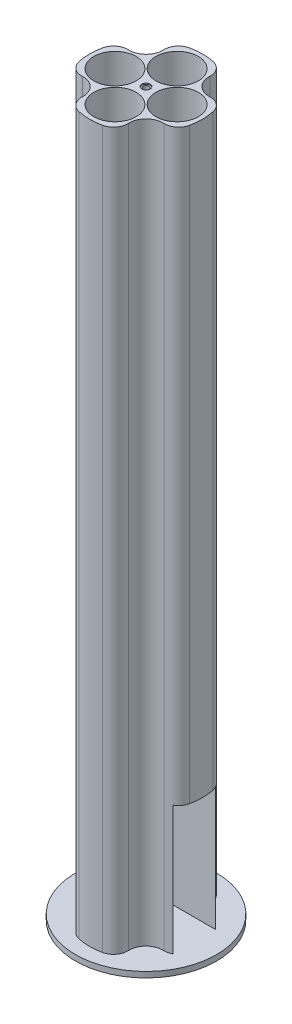
ISO-10303-21;
HEADER;
FILE_DESCRIPTION(('STEP AP214'),'2;1');
FILE_NAME('part.step','',(''),(''),'','','');
FILE_SCHEMA(('AUTOMOTIVE_DESIGN { 1 0 10303 214 1 1 1 1 }'));
ENDSEC;
DATA;
#1=APPLICATION_CONTEXT('core data for automotive mechanical design processes');
#2=APPLICATION_PROTOCOL_DEFINITION('international standard','automotive_design',2000,#1);
#3=PRODUCT_CONTEXT('',#1,'mechanical');
#4=PRODUCT('Part','Part','',(#3));
#5=PRODUCT_RELATED_PRODUCT_CATEGORY('part','',(#4));
#6=PRODUCT_DEFINITION_FORMATION('','',#4);
#7=PRODUCT_DEFINITION_CONTEXT('part definition',#1,'design');
#8=PRODUCT_DEFINITION('design','',#6,#7);
#9=PRODUCT_DEFINITION_SHAPE('','',#8);
#10=(LENGTH_UNIT() NAMED_UNIT(*) SI_UNIT(.MILLI.,.METRE.));
#11=(NAMED_UNIT(*) PLANE_ANGLE_UNIT() SI_UNIT($,.RADIAN.));
#12=(NAMED_UNIT(*) SI_UNIT($,.STERADIAN.) SOLID_ANGLE_UNIT());
#13=UNCERTAINTY_MEASURE_WITH_UNIT(LENGTH_MEASURE(1.E-05),#10,'distance_accuracy_value','');
#14=(GEOMETRIC_REPRESENTATION_CONTEXT(3) GLOBAL_UNCERTAINTY_ASSIGNED_CONTEXT((#13)) GLOBAL_UNIT_ASSIGNED_CONTEXT((#10,
#11,#12)) REPRESENTATION_CONTEXT('',''));
#15=CARTESIAN_POINT('',(0.,0.,0.));
#16=DIRECTION('',(0.,0.,1.));
#17=DIRECTION('',(1.,0.,0.));
#18=AXIS2_PLACEMENT_3D('',#15,#16,#17);
#19=CARTESIAN_POINT('',(73.3291144916706,0.,-15.7429656630339));
#20=DIRECTION('',(0.,-1.,0.));
#21=DIRECTION('',(0.,0.,-1.));
#22=AXIS2_PLACEMENT_3D('',#19,#20,#21);
#23=CYLINDRICAL_SURFACE('',#22,25.);
#24=DIRECTION('',(0.,-1.,0.));
#25=VECTOR('',#24,1.);
#26=CARTESIAN_POINT('',(97.7721526555608,1120.,-20.9906208840452));
#27=LINE('',#26,#25);
#28=CARTESIAN_POINT('',(97.7721526555608,14.9999999999999,-20.9906208840452));
#29=VERTEX_POINT('',#28);
#30=CARTESIAN_POINT('',(97.7721526555608,1055.,-20.9906208840452));
#31=VERTEX_POINT('',#30);
#32=EDGE_CURVE('E423',#29,#31,#27,.F.);
#33=ORIENTED_EDGE('',*,*,#32,.F.);
#34=CARTESIAN_POINT('',(73.3291144916706,15.,-15.7429656630339));
#35=DIRECTION('',(0.,-1.,0.));
#36=DIRECTION('',(0.,0.,-1.));
#37=AXIS2_PLACEMENT_3D('',#34,#35,#36);
#38=CIRCLE('',#37,25.);
#39=CARTESIAN_POINT('',(85.642987028776,15.,-37.5));
#40=VERTEX_POINT('',#39);
#41=EDGE_CURVE('E471',#29,#40,#38,.F.);
#42=ORIENTED_EDGE('',*,*,#41,.T.);
#43=DIRECTION('',(0.,-1.,0.));
#44=VECTOR('',#43,1.);
#45=CARTESIAN_POINT('',(85.642987028776,0.,-37.5));
#46=LINE('',#45,#44);
#47=CARTESIAN_POINT('',(85.642987028776,-213.21458,-37.5));
#48=VERTEX_POINT('',#47);
#49=EDGE_CURVE('E217',#40,#48,#46,.T.);
#50=ORIENTED_EDGE('',*,*,#49,.T.);
#51=CARTESIAN_POINT('',(73.3291144916706,-213.21458,-15.7429656630339));
#52=DIRECTION('',(0.,-1.,0.));
#53=DIRECTION('',(0.,0.,-1.));
#54=AXIS2_PLACEMENT_3D('',#51,#52,#53);
#55=CIRCLE('',#54,25.);
#56=CARTESIAN_POINT('',(72.1395659128402,-213.21458,-40.7146491100625));
#57=VERTEX_POINT('',#56);
#58=EDGE_CURVE('E228',#48,#57,#55,.F.);
#59=ORIENTED_EDGE('',*,*,#58,.T.);
#60=DIRECTION('',(0.,1.,0.));
#61=VECTOR('',#60,1.);
#62=CARTESIAN_POINT('',(72.1395659128402,0.,-40.7146491100625));
#63=LINE('',#62,#61);
#64=CARTESIAN_POINT('',(72.1395659128402,1055.,-40.7146491100625));
#65=VERTEX_POINT('',#64);
#66=EDGE_CURVE('E412',#65,#57,#63,.F.);
#67=ORIENTED_EDGE('',*,*,#66,.F.);
#68=CARTESIAN_POINT('',(73.3291144916706,1055.,-15.7429656630339));
#69=DIRECTION('',(0.,-1.,0.));
#70=DIRECTION('',(0.,0.,-1.));
#71=AXIS2_PLACEMENT_3D('',#68,#69,#70);
#72=CIRCLE('',#71,25.);
#73=EDGE_CURVE('E316',#31,#65,#72,.F.);
#74=ORIENTED_EDGE('',*,*,#73,.F.);
#75=EDGE_LOOP('',(#33,#42,#50,#59,#67,#74));
#76=FACE_BOUND('',#75,.T.);
#77=ADVANCED_FACE('F65',(#76),#23,.T.);
#78=CARTESIAN_POINT('',(-73.3291144916707,1120.,-15.7429656630334));
#79=DIRECTION('',(0.,-1.,0.));
#80=DIRECTION('',(0.,0.,-1.));
#81=AXIS2_PLACEMENT_3D('',#78,#79,#80);
#82=CYLINDRICAL_SURFACE('',#81,25.);
#83=DIRECTION('',(0.,-1.,0.));
#84=VECTOR('',#83,1.);
#85=CARTESIAN_POINT('',(-85.6429870287752,1120.,-37.5));
#86=LINE('',#85,#84);
#87=CARTESIAN_POINT('',(-85.6429870287752,-213.21458,-37.5));
#88=VERTEX_POINT('',#87);
#89=CARTESIAN_POINT('',(-85.6429870287752,15.,-37.5));
#90=VERTEX_POINT('',#89);
#91=EDGE_CURVE('E206',#88,#90,#86,.F.);
#92=ORIENTED_EDGE('',*,*,#91,.T.);
#93=CARTESIAN_POINT('',(-73.3291144916707,14.9999999999999,-15.7429656630334));
#94=DIRECTION('',(0.,-1.,0.));
#95=DIRECTION('',(0.,0.,-1.));
#96=AXIS2_PLACEMENT_3D('',#93,#94,#95);
#97=CIRCLE('',#96,25.);
#98=CARTESIAN_POINT('',(-97.772152655561,14.9999999999999,-20.9906208840445));
#99=VERTEX_POINT('',#98);
#100=EDGE_CURVE('E451',#90,#99,#97,.F.);
#101=ORIENTED_EDGE('',*,*,#100,.T.);
#102=DIRECTION('',(0.,-1.,0.));
#103=VECTOR('',#102,1.);
#104=CARTESIAN_POINT('',(-97.772152655561,1120.,-20.9906208840445));
#105=LINE('',#104,#103);
#106=CARTESIAN_POINT('',(-97.772152655561,1055.,-20.9906208840445));
#107=VERTEX_POINT('',#106);
#108=EDGE_CURVE('E392',#107,#99,#105,.T.);
#109=ORIENTED_EDGE('',*,*,#108,.F.);
#110=CARTESIAN_POINT('',(-73.3291144916707,1055.,-15.7429656630334));
#111=DIRECTION('',(0.,-1.,0.));
#112=DIRECTION('',(0.,0.,-1.));
#113=AXIS2_PLACEMENT_3D('',#110,#111,#112);
#114=CIRCLE('',#113,25.);
#115=CARTESIAN_POINT('',(-72.1395659128405,1055.,-40.714649110062));
#116=VERTEX_POINT('',#115);
#117=EDGE_CURVE('E333',#116,#107,#114,.F.);
#118=ORIENTED_EDGE('',*,*,#117,.F.);
#119=DIRECTION('',(0.,1.,0.));
#120=VECTOR('',#119,1.);
#121=CARTESIAN_POINT('',(-72.1395659128405,0.,-40.714649110062));
#122=LINE('',#121,#120);
#123=CARTESIAN_POINT('',(-72.1395659128405,-213.21458,-40.714649110062));
#124=VERTEX_POINT('',#123);
#125=EDGE_CURVE('E235',#124,#116,#122,.T.);
#126=ORIENTED_EDGE('',*,*,#125,.F.);
#127=CARTESIAN_POINT('',(-73.3291144916707,-213.21458,-15.7429656630334));
#128=DIRECTION('',(0.,-1.,0.));
#129=DIRECTION('',(0.,0.,-1.));
#130=AXIS2_PLACEMENT_3D('',#127,#128,#129);
#131=CIRCLE('',#130,25.);
#132=EDGE_CURVE('E226',#124,#88,#131,.F.);
#133=ORIENTED_EDGE('',*,*,#132,.T.);
#134=EDGE_LOOP('',(#92,#101,#109,#118,#126,#133));
#135=FACE_BOUND('',#134,.T.);
#136=ADVANCED_FACE('F233',(#135),#82,.T.);
#137=CARTESIAN_POINT('',(0.,1120.,0.));
#138=DIRECTION('',(0.,-1.,0.));
#139=DIRECTION('',(0.,0.,-1.));
#140=AXIS2_PLACEMENT_3D('',#137,#138,#139);
#141=CYLINDRICAL_SURFACE('',#140,100.);
#142=CARTESIAN_POINT('',(0.,14.9999999999999,0.));
#143=DIRECTION('',(0.,-1.,0.));
#144=DIRECTION('',(0.,0.,-1.));
#145=AXIS2_PLACEMENT_3D('',#142,#143,#144);
#146=CIRCLE('',#145,100.);
#147=CARTESIAN_POINT('',(97.7721526555608,14.9999999999999,20.9906208840452));
#148=VERTEX_POINT('',#147);
#149=EDGE_CURVE('E468',#29,#148,#146,.T.);
#150=ORIENTED_EDGE('',*,*,#149,.F.);
#151=ORIENTED_EDGE('',*,*,#32,.T.);
#152=CARTESIAN_POINT('',(0.,1055.,0.));
#153=DIRECTION('',(0.,-1.,0.));
#154=DIRECTION('',(0.,0.,-1.));
#155=AXIS2_PLACEMENT_3D('',#152,#153,#154);
#156=CIRCLE('',#155,100.);
#157=CARTESIAN_POINT('',(97.7721526555608,1055.,20.9906208840452));
#158=VERTEX_POINT('',#157);
#159=EDGE_CURVE('E312',#31,#158,#156,.T.);
#160=ORIENTED_EDGE('',*,*,#159,.T.);
#161=DIRECTION('',(0.,-1.,0.));
#162=VECTOR('',#161,1.);
#163=CARTESIAN_POINT('',(97.7721526555608,1120.,20.9906208840452));
#164=LINE('',#163,#162);
#165=EDGE_CURVE('E419',#158,#148,#164,.T.);
#166=ORIENTED_EDGE('',*,*,#165,.T.);
#167=EDGE_LOOP('',(#150,#151,#160,#166));
#168=FACE_BOUND('',#167,.T.);
#169=ADVANCED_FACE('F509',(#168),#141,.T.);
#170=CARTESIAN_POINT('',(0.,14.9999999999999,0.));
#171=DIRECTION('',(0.,-1.,0.));
#172=DIRECTION('',(0.,0.,-1.));
#173=AXIS2_PLACEMENT_3D('',#170,#171,#172);
#174=CIRCLE('',#173,100.);
#175=CARTESIAN_POINT('',(-97.772152655561,14.9999999999999,20.9906208840445));
#176=VERTEX_POINT('',#175);
#177=EDGE_CURVE('E447',#176,#99,#174,.T.);
#178=ORIENTED_EDGE('',*,*,#177,.F.);
#179=DIRECTION('',(0.,-1.,0.));
#180=VECTOR('',#179,1.);
#181=CARTESIAN_POINT('',(-97.772152655561,1120.,20.9906208840446));
#182=LINE('',#181,#180);
#183=CARTESIAN_POINT('',(-97.772152655561,1055.,20.9906208840446));
#184=VERTEX_POINT('',#183);
#185=EDGE_CURVE('E396',#176,#184,#182,.F.);
#186=ORIENTED_EDGE('',*,*,#185,.T.);
#187=CARTESIAN_POINT('',(0.,1055.,0.));
#188=DIRECTION('',(0.,-1.,0.));
#189=DIRECTION('',(0.,0.,-1.));
#190=AXIS2_PLACEMENT_3D('',#187,#188,#189);
#191=CIRCLE('',#190,100.);
#192=EDGE_CURVE('E326',#184,#107,#191,.T.);
#193=ORIENTED_EDGE('',*,*,#192,.T.);
#194=ORIENTED_EDGE('',*,*,#108,.T.);
#195=EDGE_LOOP('',(#178,#186,#193,#194));
#196=FACE_BOUND('',#195,.T.);
#197=ADVANCED_FACE('F441',(#196),#141,.T.);
#198=CARTESIAN_POINT('',(0.,-79.9999999999998,0.));
#199=DIRECTION('',(0.,1.,0.));
#200=DIRECTION('',(0.,0.,1.));
#201=AXIS2_PLACEMENT_3D('',#198,#199,#200);
#202=CYLINDRICAL_SURFACE('',#201,5.);
#203=CARTESIAN_POINT('',(0.,1053.,0.));
#204=DIRECTION('',(0.,1.,0.));
#205=DIRECTION('',(0.,0.,1.));
#206=AXIS2_PLACEMENT_3D('',#203,#204,#205);
#207=CIRCLE('',#206,5.);
#208=CARTESIAN_POINT('',(0.,1053.,5.));
#209=VERTEX_POINT('',#208);
#210=EDGE_CURVE('E290',#209,#209,#207,.F.);
#211=ORIENTED_EDGE('',*,*,#210,.F.);
#212=EDGE_LOOP('',(#211));
#213=FACE_BOUND('',#212,.T.);
#214=CARTESIAN_POINT('',(0.,15.,0.));
#215=DIRECTION('',(0.,-1.,0.));
#216=DIRECTION('',(0.,0.,-1.));
#217=AXIS2_PLACEMENT_3D('',#214,#215,#216);
#218=CIRCLE('',#217,5.);
#219=CARTESIAN_POINT('',(0.,15.,-5.));
#220=VERTEX_POINT('',#219);
#221=EDGE_CURVE('E69',#220,#220,#218,.F.);
#222=ORIENTED_EDGE('',*,*,#221,.F.);
#223=EDGE_LOOP('',(#222));
#224=FACE_BOUND('',#223,.T.);
#225=ADVANCED_FACE('F437',(#213,#224),#202,.F.);
#226=CARTESIAN_POINT('',(-73.3291144916707,0.,15.7429656630334));
#227=DIRECTION('',(0.,-1.,0.));
#228=DIRECTION('',(0.,0.,-1.));
#229=AXIS2_PLACEMENT_3D('',#226,#227,#228);
#230=CYLINDRICAL_SURFACE('',#229,25.);
#231=DIRECTION('',(0.,-1.,0.));
#232=VECTOR('',#231,1.);
#233=CARTESIAN_POINT('',(-85.6429870287752,0.,37.5));
#234=LINE('',#233,#232);
#235=CARTESIAN_POINT('',(-85.6429870287752,-213.21458,37.5));
#236=VERTEX_POINT('',#235);
#237=CARTESIAN_POINT('',(-85.6429870287752,15.,37.5));
#238=VERTEX_POINT('',#237);
#239=EDGE_CURVE('E448',#236,#238,#234,.F.);
#240=ORIENTED_EDGE('',*,*,#239,.F.);
#241=CARTESIAN_POINT('',(-73.3291144916707,-213.21458,15.7429656630334));
#242=DIRECTION('',(0.,-1.,0.));
#243=DIRECTION('',(0.,0.,-1.));
#244=AXIS2_PLACEMENT_3D('',#241,#242,#243);
#245=CIRCLE('',#244,25.);
#246=CARTESIAN_POINT('',(-72.1395659128405,-213.21458,40.714649110062));
#247=VERTEX_POINT('',#246);
#248=EDGE_CURVE('E83',#236,#247,#245,.F.);
#249=ORIENTED_EDGE('',*,*,#248,.T.);
#250=DIRECTION('',(0.,1.,0.));
#251=VECTOR('',#250,1.);
#252=CARTESIAN_POINT('',(-72.1395659128405,0.,40.714649110062));
#253=LINE('',#252,#251);
#254=CARTESIAN_POINT('',(-72.1395659128405,1055.,40.714649110062));
#255=VERTEX_POINT('',#254);
#256=EDGE_CURVE('E379',#255,#247,#253,.F.);
#257=ORIENTED_EDGE('',*,*,#256,.F.);
#258=CARTESIAN_POINT('',(-73.3291144916707,1055.,15.7429656630334));
#259=DIRECTION('',(0.,-1.,0.));
#260=DIRECTION('',(0.,0.,-1.));
#261=AXIS2_PLACEMENT_3D('',#258,#259,#260);
#262=CIRCLE('',#261,25.);
#263=EDGE_CURVE('E319',#184,#255,#262,.F.);
#264=ORIENTED_EDGE('',*,*,#263,.F.);
#265=ORIENTED_EDGE('',*,*,#185,.F.);
#266=CARTESIAN_POINT('',(-73.3291144916707,15.,15.7429656630334));
#267=DIRECTION('',(0.,-1.,0.));
#268=DIRECTION('',(0.,0.,-1.));
#269=AXIS2_PLACEMENT_3D('',#266,#267,#268);
#270=CIRCLE('',#269,25.);
#271=EDGE_CURVE('E464',#176,#238,#270,.F.);
#272=ORIENTED_EDGE('',*,*,#271,.T.);
#273=EDGE_LOOP('',(#240,#249,#257,#264,#265,#272));
#274=FACE_BOUND('',#273,.T.);
#275=ADVANCED_FACE('F440',(#274),#230,.T.);
#276=CARTESIAN_POINT('',(-15.7429656630342,1120.,73.3291144916706));
#277=DIRECTION('',(0.,-1.,0.));
#278=DIRECTION('',(0.,0.,-1.));
#279=AXIS2_PLACEMENT_3D('',#276,#277,#278);
#280=CYLINDRICAL_SURFACE('',#279,25.);
#281=DIRECTION('',(0.,1.,0.));
#282=VECTOR('',#281,1.);
#283=CARTESIAN_POINT('',(-40.7146491100628,0.,72.1395659128401));
#284=LINE('',#283,#282);
#285=CARTESIAN_POINT('',(-40.7146491100628,-213.21458,72.1395659128401));
#286=VERTEX_POINT('',#285);
#287=CARTESIAN_POINT('',(-40.7146491100628,1055.,72.1395659128401));
#288=VERTEX_POINT('',#287);
#289=EDGE_CURVE('E382',#286,#288,#284,.T.);
#290=ORIENTED_EDGE('',*,*,#289,.F.);
#291=CARTESIAN_POINT('',(-15.7429656630342,-213.21458,73.3291144916706));
#292=DIRECTION('',(0.,-1.,0.));
#293=DIRECTION('',(0.,0.,-1.));
#294=AXIS2_PLACEMENT_3D('',#291,#292,#293);
#295=CIRCLE('',#294,25.);
#296=CARTESIAN_POINT('',(-20.9906208840455,-213.21458,97.7721526555607));
#297=VERTEX_POINT('',#296);
#298=EDGE_CURVE('E255',#286,#297,#295,.F.);
#299=ORIENTED_EDGE('',*,*,#298,.T.);
#300=DIRECTION('',(0.,-1.,0.));
#301=VECTOR('',#300,1.);
#302=CARTESIAN_POINT('',(-20.9906208840455,1120.,97.7721526555607));
#303=LINE('',#302,#301);
#304=CARTESIAN_POINT('',(-20.9906208840455,1055.,97.7721526555607));
#305=VERTEX_POINT('',#304);
#306=EDGE_CURVE('E388',#305,#297,#303,.T.);
#307=ORIENTED_EDGE('',*,*,#306,.F.);
#308=CARTESIAN_POINT('',(-15.7429656630342,1055.,73.3291144916706));
#309=DIRECTION('',(0.,-1.,0.));
#310=DIRECTION('',(0.,0.,-1.));
#311=AXIS2_PLACEMENT_3D('',#308,#309,#310);
#312=CIRCLE('',#311,25.);
#313=EDGE_CURVE('E305',#288,#305,#312,.F.);
#314=ORIENTED_EDGE('',*,*,#313,.F.);
#315=EDGE_LOOP('',(#290,#299,#307,#314));
#316=FACE_BOUND('',#315,.T.);
#317=ADVANCED_FACE('F556',(#316),#280,.T.);
#318=CARTESIAN_POINT('',(-70.7106781186551,0.,70.7106781186544));
#319=DIRECTION('',(0.,1.,0.));
#320=DIRECTION('',(0.,0.,1.));
#321=AXIS2_PLACEMENT_3D('',#318,#319,#320);
#322=CYLINDRICAL_SURFACE('',#321,30.0300429006135);
#323=CARTESIAN_POINT('',(-70.7106781186551,-213.21458,70.7106781186544));
#324=DIRECTION('',(0.,-1.,0.));
#325=DIRECTION('',(0.,0.,-1.));
#326=AXIS2_PLACEMENT_3D('',#323,#324,#325);
#327=CIRCLE('',#326,30.0300429006135);
#328=EDGE_CURVE('E90',#286,#247,#327,.F.);
#329=ORIENTED_EDGE('',*,*,#328,.F.);
#330=ORIENTED_EDGE('',*,*,#289,.T.);
#331=CARTESIAN_POINT('',(-70.7106781186551,1055.,70.7106781186544));
#332=DIRECTION('',(0.,-1.,0.));
#333=DIRECTION('',(0.,0.,-1.));
#334=AXIS2_PLACEMENT_3D('',#331,#332,#333);
#335=CIRCLE('',#334,30.0300429006135);
#336=EDGE_CURVE('E308',#288,#255,#335,.F.);
#337=ORIENTED_EDGE('',*,*,#336,.T.);
#338=ORIENTED_EDGE('',*,*,#256,.T.);
#339=EDGE_LOOP('',(#329,#330,#337,#338));
#340=FACE_BOUND('',#339,.T.);
#341=ADVANCED_FACE('F524',(#340),#322,.F.);
#342=CARTESIAN_POINT('',(15.7429656630337,0.,73.3291144916707));
#343=DIRECTION('',(0.,-1.,0.));
#344=DIRECTION('',(0.,0.,-1.));
#345=AXIS2_PLACEMENT_3D('',#342,#343,#344);
#346=CYLINDRICAL_SURFACE('',#345,25.);
#347=DIRECTION('',(0.,-1.,0.));
#348=VECTOR('',#347,1.);
#349=CARTESIAN_POINT('',(20.9906208840449,1120.,97.7721526555609));
#350=LINE('',#349,#348);
#351=CARTESIAN_POINT('',(20.9906208840449,-213.21458,97.7721526555609));
#352=VERTEX_POINT('',#351);
#353=CARTESIAN_POINT('',(20.9906208840449,1055.,97.7721526555609));
#354=VERTEX_POINT('',#353);
#355=EDGE_CURVE('E385',#352,#354,#350,.F.);
#356=ORIENTED_EDGE('',*,*,#355,.F.);
#357=CARTESIAN_POINT('',(15.7429656630337,-213.21458,73.3291144916707));
#358=DIRECTION('',(0.,-1.,0.));
#359=DIRECTION('',(0.,0.,-1.));
#360=AXIS2_PLACEMENT_3D('',#357,#358,#359);
#361=CIRCLE('',#360,25.);
#362=CARTESIAN_POINT('',(40.7146491100623,-213.21458,72.1395659128404));
#363=VERTEX_POINT('',#362);
#364=EDGE_CURVE('E269',#352,#363,#361,.F.);
#365=ORIENTED_EDGE('',*,*,#364,.T.);
#366=DIRECTION('',(0.,1.,0.));
#367=VECTOR('',#366,1.);
#368=CARTESIAN_POINT('',(40.7146491100623,0.,72.1395659128404));
#369=LINE('',#368,#367);
#370=CARTESIAN_POINT('',(40.7146491100623,1055.,72.1395659128404));
#371=VERTEX_POINT('',#370);
#372=EDGE_CURVE('E426',#371,#363,#369,.F.);
#373=ORIENTED_EDGE('',*,*,#372,.F.);
#374=CARTESIAN_POINT('',(15.7429656630337,1055.,73.3291144916707));
#375=DIRECTION('',(0.,-1.,0.));
#376=DIRECTION('',(0.,0.,-1.));
#377=AXIS2_PLACEMENT_3D('',#374,#375,#376);
#378=CIRCLE('',#377,25.);
#379=EDGE_CURVE('E12',#354,#371,#378,.F.);
#380=ORIENTED_EDGE('',*,*,#379,.F.);
#381=EDGE_LOOP('',(#356,#365,#373,#380));
#382=FACE_BOUND('',#381,.T.);
#383=ADVANCED_FACE('F67',(#382),#346,.T.);
#384=CARTESIAN_POINT('',(73.3291144916706,1120.,15.7429656630339));
#385=DIRECTION('',(0.,-1.,0.));
#386=DIRECTION('',(0.,0.,-1.));
#387=AXIS2_PLACEMENT_3D('',#384,#385,#386);
#388=CYLINDRICAL_SURFACE('',#387,25.);
#389=DIRECTION('',(0.,-1.,0.));
#390=VECTOR('',#389,1.);
#391=CARTESIAN_POINT('',(85.642987028776,1120.,37.5));
#392=LINE('',#391,#390);
#393=CARTESIAN_POINT('',(85.642987028776,14.9999999999999,37.5));
#394=VERTEX_POINT('',#393);
#395=CARTESIAN_POINT('',(85.642987028776,-213.21458,37.5));
#396=VERTEX_POINT('',#395);
#397=EDGE_CURVE('E453',#394,#396,#392,.T.);
#398=ORIENTED_EDGE('',*,*,#397,.F.);
#399=CARTESIAN_POINT('',(73.3291144916706,14.9999999999999,15.7429656630339));
#400=DIRECTION('',(0.,-1.,0.));
#401=DIRECTION('',(0.,0.,-1.));
#402=AXIS2_PLACEMENT_3D('',#399,#400,#401);
#403=CIRCLE('',#402,25.);
#404=EDGE_CURVE('E475',#394,#148,#403,.F.);
#405=ORIENTED_EDGE('',*,*,#404,.T.);
#406=ORIENTED_EDGE('',*,*,#165,.F.);
#407=CARTESIAN_POINT('',(73.3291144916706,1055.,15.7429656630339));
#408=DIRECTION('',(0.,-1.,0.));
#409=DIRECTION('',(0.,0.,-1.));
#410=AXIS2_PLACEMENT_3D('',#407,#408,#409);
#411=CIRCLE('',#410,25.);
#412=CARTESIAN_POINT('',(72.1395659128402,1055.,40.7146491100625));
#413=VERTEX_POINT('',#412);
#414=EDGE_CURVE('E302',#413,#158,#411,.F.);
#415=ORIENTED_EDGE('',*,*,#414,.F.);
#416=DIRECTION('',(0.,1.,0.));
#417=VECTOR('',#416,1.);
#418=CARTESIAN_POINT('',(72.1395659128402,0.,40.7146491100625));
#419=LINE('',#418,#417);
#420=CARTESIAN_POINT('',(72.1395659128402,-213.21458,40.7146491100625));
#421=VERTEX_POINT('',#420);
#422=EDGE_CURVE('E75',#421,#413,#419,.T.);
#423=ORIENTED_EDGE('',*,*,#422,.F.);
#424=CARTESIAN_POINT('',(73.3291144916706,-213.21458,15.7429656630339));
#425=DIRECTION('',(0.,-1.,0.));
#426=DIRECTION('',(0.,0.,-1.));
#427=AXIS2_PLACEMENT_3D('',#424,#425,#426);
#428=CIRCLE('',#427,25.);
#429=EDGE_CURVE('E281',#421,#396,#428,.F.);
#430=ORIENTED_EDGE('',*,*,#429,.T.);
#431=EDGE_LOOP('',(#398,#405,#406,#415,#423,#430));
#432=FACE_BOUND('',#431,.T.);
#433=ADVANCED_FACE('F515',(#432),#388,.T.);
#434=CARTESIAN_POINT('',(70.7106781186546,0.,70.7106781186549));
#435=DIRECTION('',(0.,1.,0.));
#436=DIRECTION('',(0.,0.,1.));
#437=AXIS2_PLACEMENT_3D('',#434,#435,#436);
#438=CYLINDRICAL_SURFACE('',#437,30.0300429006135);
#439=CARTESIAN_POINT('',(70.7106781186546,-213.21458,70.7106781186549));
#440=DIRECTION('',(0.,-1.,0.));
#441=DIRECTION('',(0.,0.,-1.));
#442=AXIS2_PLACEMENT_3D('',#439,#440,#441);
#443=CIRCLE('',#442,30.0300429006135);
#444=EDGE_CURVE('E277',#421,#363,#443,.F.);
#445=ORIENTED_EDGE('',*,*,#444,.F.);
#446=ORIENTED_EDGE('',*,*,#422,.T.);
#447=CARTESIAN_POINT('',(70.7106781186546,1055.,70.7106781186549));
#448=DIRECTION('',(0.,-1.,0.));
#449=DIRECTION('',(0.,0.,-1.));
#450=AXIS2_PLACEMENT_3D('',#447,#448,#449);
#451=CIRCLE('',#450,30.0300429006135);
#452=EDGE_CURVE('E294',#413,#371,#451,.F.);
#453=ORIENTED_EDGE('',*,*,#452,.T.);
#454=ORIENTED_EDGE('',*,*,#372,.T.);
#455=EDGE_LOOP('',(#445,#446,#453,#454));
#456=FACE_BOUND('',#455,.T.);
#457=ADVANCED_FACE('F517',(#456),#438,.F.);
#458=CARTESIAN_POINT('',(15.7429656630337,1120.,-73.3291144916707));
#459=DIRECTION('',(0.,-1.,0.));
#460=DIRECTION('',(0.,0.,-1.));
#461=AXIS2_PLACEMENT_3D('',#458,#459,#460);
#462=CYLINDRICAL_SURFACE('',#461,25.);
#463=DIRECTION('',(0.,1.,0.));
#464=VECTOR('',#463,1.);
#465=CARTESIAN_POINT('',(40.7146491100623,0.,-72.1395659128404));
#466=LINE('',#465,#464);
#467=CARTESIAN_POINT('',(40.7146491100623,-213.21458,-72.1395659128404));
#468=VERTEX_POINT('',#467);
#469=CARTESIAN_POINT('',(40.7146491100623,1055.,-72.1395659128404));
#470=VERTEX_POINT('',#469);
#471=EDGE_CURVE('E416',#468,#470,#466,.T.);
#472=ORIENTED_EDGE('',*,*,#471,.F.);
#473=CARTESIAN_POINT('',(15.7429656630337,-213.21458,-73.3291144916707));
#474=DIRECTION('',(0.,-1.,0.));
#475=DIRECTION('',(0.,0.,-1.));
#476=AXIS2_PLACEMENT_3D('',#473,#474,#475);
#477=CIRCLE('',#476,25.);
#478=CARTESIAN_POINT('',(20.9906208840449,-213.21458,-97.7721526555609));
#479=VERTEX_POINT('',#478);
#480=EDGE_CURVE('E266',#468,#479,#477,.F.);
#481=ORIENTED_EDGE('',*,*,#480,.T.);
#482=DIRECTION('',(0.,-1.,0.));
#483=VECTOR('',#482,1.);
#484=CARTESIAN_POINT('',(20.9906208840449,1120.,-97.7721526555609));
#485=LINE('',#484,#483);
#486=CARTESIAN_POINT('',(20.9906208840449,1055.,-97.7721526555609));
#487=VERTEX_POINT('',#486);
#488=EDGE_CURVE('E405',#487,#479,#485,.T.);
#489=ORIENTED_EDGE('',*,*,#488,.F.);
#490=CARTESIAN_POINT('',(15.7429656630337,1055.,-73.3291144916707));
#491=DIRECTION('',(0.,-1.,0.));
#492=DIRECTION('',(0.,0.,-1.));
#493=AXIS2_PLACEMENT_3D('',#490,#491,#492);
#494=CIRCLE('',#493,25.);
#495=EDGE_CURVE('E330',#470,#487,#494,.F.);
#496=ORIENTED_EDGE('',*,*,#495,.F.);
#497=EDGE_LOOP('',(#472,#481,#489,#496));
#498=FACE_BOUND('',#497,.T.);
#499=ADVANCED_FACE('F513',(#498),#462,.T.);
#500=CARTESIAN_POINT('',(70.7106781186546,0.,-70.7106781186549));
#501=DIRECTION('',(0.,1.,0.));
#502=DIRECTION('',(0.,0.,1.));
#503=AXIS2_PLACEMENT_3D('',#500,#501,#502);
#504=CYLINDRICAL_SURFACE('',#503,30.0300429006135);
#505=CARTESIAN_POINT('',(70.7106781186546,-213.21458,-70.7106781186549));
#506=DIRECTION('',(0.,-1.,0.));
#507=DIRECTION('',(0.,0.,-1.));
#508=AXIS2_PLACEMENT_3D('',#505,#506,#507);
#509=CIRCLE('',#508,30.0300429006135);
#510=EDGE_CURVE('E272',#468,#57,#509,.F.);
#511=ORIENTED_EDGE('',*,*,#510,.F.);
#512=ORIENTED_EDGE('',*,*,#471,.T.);
#513=CARTESIAN_POINT('',(70.7106781186546,1055.,-70.7106781186549));
#514=DIRECTION('',(0.,-1.,0.));
#515=DIRECTION('',(0.,0.,-1.));
#516=AXIS2_PLACEMENT_3D('',#513,#514,#515);
#517=CIRCLE('',#516,30.0300429006135);
#518=EDGE_CURVE('E322',#470,#65,#517,.F.);
#519=ORIENTED_EDGE('',*,*,#518,.T.);
#520=ORIENTED_EDGE('',*,*,#66,.T.);
#521=EDGE_LOOP('',(#511,#512,#519,#520));
#522=FACE_BOUND('',#521,.T.);
#523=ADVANCED_FACE('F571',(#522),#504,.F.);
#524=CARTESIAN_POINT('',(-15.7429656630342,0.,-73.3291144916705));
#525=DIRECTION('',(0.,-1.,0.));
#526=DIRECTION('',(0.,0.,-1.));
#527=AXIS2_PLACEMENT_3D('',#524,#525,#526);
#528=CYLINDRICAL_SURFACE('',#527,25.);
#529=DIRECTION('',(0.,-1.,0.));
#530=VECTOR('',#529,1.);
#531=CARTESIAN_POINT('',(-20.9906208840456,1120.,-97.7721526555607));
#532=LINE('',#531,#530);
#533=CARTESIAN_POINT('',(-20.9906208840456,-213.21458,-97.7721526555607));
#534=VERTEX_POINT('',#533);
#535=CARTESIAN_POINT('',(-20.9906208840456,1055.,-97.7721526555607));
#536=VERTEX_POINT('',#535);
#537=EDGE_CURVE('E409',#534,#536,#532,.F.);
#538=ORIENTED_EDGE('',*,*,#537,.F.);
#539=CARTESIAN_POINT('',(-15.7429656630342,-213.21458,-73.3291144916705));
#540=DIRECTION('',(0.,-1.,0.));
#541=DIRECTION('',(0.,0.,-1.));
#542=AXIS2_PLACEMENT_3D('',#539,#540,#541);
#543=CIRCLE('',#542,25.);
#544=CARTESIAN_POINT('',(-40.7146491100628,-213.21458,-72.1395659128401));
#545=VERTEX_POINT('',#544);
#546=EDGE_CURVE('E250',#534,#545,#543,.F.);
#547=ORIENTED_EDGE('',*,*,#546,.T.);
#548=DIRECTION('',(0.,1.,0.));
#549=VECTOR('',#548,1.);
#550=CARTESIAN_POINT('',(-40.7146491100628,0.,-72.1395659128401));
#551=LINE('',#550,#549);
#552=CARTESIAN_POINT('',(-40.7146491100628,1055.,-72.1395659128401));
#553=VERTEX_POINT('',#552);
#554=EDGE_CURVE('E399',#553,#545,#551,.F.);
#555=ORIENTED_EDGE('',*,*,#554,.F.);
#556=CARTESIAN_POINT('',(-15.7429656630342,1055.,-73.3291144916705));
#557=DIRECTION('',(0.,-1.,0.));
#558=DIRECTION('',(0.,0.,-1.));
#559=AXIS2_PLACEMENT_3D('',#556,#557,#558);
#560=CIRCLE('',#559,25.);
#561=EDGE_CURVE('E344',#536,#553,#560,.F.);
#562=ORIENTED_EDGE('',*,*,#561,.F.);
#563=EDGE_LOOP('',(#538,#547,#555,#562));
#564=FACE_BOUND('',#563,.T.);
#565=ADVANCED_FACE('F585',(#564),#528,.T.);
#566=CARTESIAN_POINT('',(-70.7106781186551,0.,-70.7106781186544));
#567=DIRECTION('',(0.,1.,0.));
#568=DIRECTION('',(0.,0.,1.));
#569=AXIS2_PLACEMENT_3D('',#566,#567,#568);
#570=CYLINDRICAL_SURFACE('',#569,30.0300429006135);
#571=CARTESIAN_POINT('',(-70.7106781186551,-213.21458,-70.7106781186544));
#572=DIRECTION('',(0.,-1.,0.));
#573=DIRECTION('',(0.,0.,-1.));
#574=AXIS2_PLACEMENT_3D('',#571,#572,#573);
#575=CIRCLE('',#574,30.0300429006135);
#576=EDGE_CURVE('E241',#124,#545,#575,.F.);
#577=ORIENTED_EDGE('',*,*,#576,.F.);
#578=ORIENTED_EDGE('',*,*,#125,.T.);
#579=CARTESIAN_POINT('',(-70.7106781186551,1055.,-70.7106781186544));
#580=DIRECTION('',(0.,-1.,0.));
#581=DIRECTION('',(0.,0.,-1.));
#582=AXIS2_PLACEMENT_3D('',#579,#580,#581);
#583=CIRCLE('',#582,30.0300429006135);
#584=EDGE_CURVE('E336',#116,#553,#583,.F.);
#585=ORIENTED_EDGE('',*,*,#584,.T.);
#586=ORIENTED_EDGE('',*,*,#554,.T.);
#587=EDGE_LOOP('',(#577,#578,#585,#586));
#588=FACE_BOUND('',#587,.T.);
#589=ADVANCED_FACE('F587',(#588),#570,.F.);
#590=CARTESIAN_POINT('',(0.,-213.21458,0.));
#591=DIRECTION('',(0.,-1.,0.));
#592=DIRECTION('',(0.,0.,-1.));
#593=AXIS2_PLACEMENT_3D('',#590,#591,#592);
#594=CIRCLE('',#593,100.);
#595=EDGE_CURVE('E262',#534,#479,#594,.T.);
#596=ORIENTED_EDGE('',*,*,#595,.F.);
#597=ORIENTED_EDGE('',*,*,#537,.T.);
#598=CARTESIAN_POINT('',(0.,1055.,0.));
#599=DIRECTION('',(0.,-1.,0.));
#600=DIRECTION('',(0.,0.,-1.));
#601=AXIS2_PLACEMENT_3D('',#598,#599,#600);
#602=CIRCLE('',#601,100.);
#603=EDGE_CURVE('E340',#536,#487,#602,.T.);
#604=ORIENTED_EDGE('',*,*,#603,.T.);
#605=ORIENTED_EDGE('',*,*,#488,.T.);
#606=EDGE_LOOP('',(#596,#597,#604,#605));
#607=FACE_BOUND('',#606,.T.);
#608=ADVANCED_FACE('F579',(#607),#141,.T.);
#609=CARTESIAN_POINT('',(0.,-213.21458,0.));
#610=DIRECTION('',(0.,-1.,0.));
#611=DIRECTION('',(0.,0.,-1.));
#612=AXIS2_PLACEMENT_3D('',#609,#610,#611);
#613=CIRCLE('',#612,100.);
#614=EDGE_CURVE('E258',#352,#297,#613,.T.);
#615=ORIENTED_EDGE('',*,*,#614,.F.);
#616=ORIENTED_EDGE('',*,*,#355,.T.);
#617=CARTESIAN_POINT('',(0.,1055.,0.));
#618=DIRECTION('',(0.,-1.,0.));
#619=DIRECTION('',(0.,0.,-1.));
#620=AXIS2_PLACEMENT_3D('',#617,#618,#619);
#621=CIRCLE('',#620,100.);
#622=EDGE_CURVE('E298',#354,#305,#621,.T.);
#623=ORIENTED_EDGE('',*,*,#622,.T.);
#624=ORIENTED_EDGE('',*,*,#306,.T.);
#625=EDGE_LOOP('',(#615,#616,#623,#624));
#626=FACE_BOUND('',#625,.T.);
#627=ADVANCED_FACE('F559',(#626),#141,.T.);
#628=CARTESIAN_POINT('',(0.,20.,-55.));
#629=DIRECTION('',(0.,1.,0.));
#630=DIRECTION('',(0.,0.,1.));
#631=AXIS2_PLACEMENT_3D('',#628,#629,#630);
#632=CYLINDRICAL_SURFACE('',#631,37.5);
#633=CARTESIAN_POINT('',(0.,1055.,-55.));
#634=DIRECTION('',(0.,-1.,0.));
#635=DIRECTION('',(0.,0.,-1.));
#636=AXIS2_PLACEMENT_3D('',#633,#634,#635);
#637=CIRCLE('',#636,37.5);
#638=CARTESIAN_POINT('',(0.,1055.,-92.5));
#639=VERTEX_POINT('',#638);
#640=EDGE_CURVE('E359',#639,#639,#637,.F.);
#641=ORIENTED_EDGE('',*,*,#640,.T.);
#642=EDGE_LOOP('',(#641));
#643=FACE_BOUND('',#642,.T.);
#644=CARTESIAN_POINT('',(0.,20.,-55.));
#645=DIRECTION('',(0.,1.,0.));
#646=DIRECTION('',(0.,0.,1.));
#647=AXIS2_PLACEMENT_3D('',#644,#645,#646);
#648=CIRCLE('',#647,37.5);
#649=CARTESIAN_POINT('',(0.,20.,-17.5));
#650=VERTEX_POINT('',#649);
#651=EDGE_CURVE('E372',#650,#650,#648,.T.);
#652=ORIENTED_EDGE('',*,*,#651,.F.);
#653=EDGE_LOOP('',(#652));
#654=FACE_BOUND('',#653,.T.);
#655=ADVANCED_FACE('F624',(#643,#654),#632,.F.);
#656=CARTESIAN_POINT('',(0.,20.,-55.));
#657=DIRECTION('',(0.,1.,0.));
#658=DIRECTION('',(0.,0.,1.));
#659=AXIS2_PLACEMENT_3D('',#656,#657,#658);
#660=PLANE('',#659);
#661=ORIENTED_EDGE('',*,*,#651,.T.);
#662=EDGE_LOOP('',(#661));
#663=FACE_BOUND('',#662,.T.);
#664=ADVANCED_FACE('F621',(#663),#660,.T.);
#665=CARTESIAN_POINT('',(0.,1055.,0.));
#666=DIRECTION('',(0.,-1.,0.));
#667=DIRECTION('',(0.,0.,-1.));
#668=AXIS2_PLACEMENT_3D('',#665,#666,#667);
#669=PLANE('',#668);
#670=CARTESIAN_POINT('',(0.,1055.,0.));
#671=DIRECTION('',(0.,1.,0.));
#672=DIRECTION('',(0.,0.,1.));
#673=AXIS2_PLACEMENT_3D('',#670,#671,#672);
#674=CIRCLE('',#673,7.5);
#675=CARTESIAN_POINT('',(0.,1055.,7.5));
#676=VERTEX_POINT('',#675);
#677=EDGE_CURVE('E285',#676,#676,#674,.T.);
#678=ORIENTED_EDGE('',*,*,#677,.F.);
#679=EDGE_LOOP('',(#678));
#680=FACE_BOUND('',#679,.T.);
#681=CARTESIAN_POINT('',(0.,1055.,55.));
#682=DIRECTION('',(0.,-1.,0.));
#683=DIRECTION('',(0.,0.,-1.));
#684=AXIS2_PLACEMENT_3D('',#681,#682,#683);
#685=CIRCLE('',#684,37.5);
#686=CARTESIAN_POINT('',(0.,1055.,17.5));
#687=VERTEX_POINT('',#686);
#688=EDGE_CURVE('E355',#687,#687,#685,.F.);
#689=ORIENTED_EDGE('',*,*,#688,.F.);
#690=EDGE_LOOP('',(#689));
#691=FACE_BOUND('',#690,.T.);
#692=CARTESIAN_POINT('',(-55.,1055.,0.));
#693=DIRECTION('',(0.,-1.,0.));
#694=DIRECTION('',(0.,0.,-1.));
#695=AXIS2_PLACEMENT_3D('',#692,#693,#694);
#696=CIRCLE('',#695,37.5);
#697=CARTESIAN_POINT('',(-55.,1055.,-37.5));
#698=VERTEX_POINT('',#697);
#699=EDGE_CURVE('E347',#698,#698,#696,.F.);
#700=ORIENTED_EDGE('',*,*,#699,.F.);
#701=EDGE_LOOP('',(#700));
#702=FACE_BOUND('',#701,.T.);
#703=ORIENTED_EDGE('',*,*,#561,.T.);
#704=ORIENTED_EDGE('',*,*,#584,.F.);
#705=ORIENTED_EDGE('',*,*,#117,.T.);
#706=ORIENTED_EDGE('',*,*,#192,.F.);
#707=ORIENTED_EDGE('',*,*,#263,.T.);
#708=ORIENTED_EDGE('',*,*,#336,.F.);
#709=ORIENTED_EDGE('',*,*,#313,.T.);
#710=ORIENTED_EDGE('',*,*,#622,.F.);
#711=ORIENTED_EDGE('',*,*,#379,.T.);
#712=ORIENTED_EDGE('',*,*,#452,.F.);
#713=ORIENTED_EDGE('',*,*,#414,.T.);
#714=ORIENTED_EDGE('',*,*,#159,.F.);
#715=ORIENTED_EDGE('',*,*,#73,.T.);
#716=ORIENTED_EDGE('',*,*,#518,.F.);
#717=ORIENTED_EDGE('',*,*,#495,.T.);
#718=ORIENTED_EDGE('',*,*,#603,.F.);
#719=EDGE_LOOP('',(#703,#704,#705,#706,#707,#708,#709,#710,#711,#712,#713,#714,#715,#716,#717,#718));
#720=FACE_BOUND('',#719,.T.);
#721=CARTESIAN_POINT('',(55.,1055.,0.));
#722=DIRECTION('',(0.,-1.,0.));
#723=DIRECTION('',(0.,0.,-1.));
#724=AXIS2_PLACEMENT_3D('',#721,#722,#723);
#725=CIRCLE('',#724,37.5);
#726=CARTESIAN_POINT('',(55.,1055.,-37.5));
#727=VERTEX_POINT('',#726);
#728=EDGE_CURVE('E351',#727,#727,#725,.F.);
#729=ORIENTED_EDGE('',*,*,#728,.F.);
#730=EDGE_LOOP('',(#729));
#731=FACE_BOUND('',#730,.T.);
#732=ORIENTED_EDGE('',*,*,#640,.F.);
#733=EDGE_LOOP('',(#732));
#734=FACE_BOUND('',#733,.T.);
#735=ADVANCED_FACE('F548',(#680,#691,#702,#720,#731,#734),#669,.F.);
#736=CARTESIAN_POINT('',(-55.,20.,0.));
#737=DIRECTION('',(0.,1.,0.));
#738=DIRECTION('',(0.,0.,1.));
#739=AXIS2_PLACEMENT_3D('',#736,#737,#738);
#740=PLANE('',#739);
#741=CARTESIAN_POINT('',(-55.,20.,0.));
#742=DIRECTION('',(0.,1.,0.));
#743=DIRECTION('',(0.,0.,1.));
#744=AXIS2_PLACEMENT_3D('',#741,#742,#743);
#745=CIRCLE('',#744,37.5);
#746=CARTESIAN_POINT('',(-55.,20.,37.5));
#747=VERTEX_POINT('',#746);
#748=EDGE_CURVE('E368',#747,#747,#745,.T.);
#749=ORIENTED_EDGE('',*,*,#748,.T.);
#750=EDGE_LOOP('',(#749));
#751=FACE_BOUND('',#750,.T.);
#752=ADVANCED_FACE('F610',(#751),#740,.T.);
#753=CARTESIAN_POINT('',(-55.,20.,0.));
#754=DIRECTION('',(0.,1.,0.));
#755=DIRECTION('',(0.,0.,1.));
#756=AXIS2_PLACEMENT_3D('',#753,#754,#755);
#757=CYLINDRICAL_SURFACE('',#756,37.5);
#758=ORIENTED_EDGE('',*,*,#699,.T.);
#759=EDGE_LOOP('',(#758));
#760=FACE_BOUND('',#759,.T.);
#761=ORIENTED_EDGE('',*,*,#748,.F.);
#762=EDGE_LOOP('',(#761));
#763=FACE_BOUND('',#762,.T.);
#764=ADVANCED_FACE('F606',(#760,#763),#757,.F.);
#765=CARTESIAN_POINT('',(55.,20.,0.));
#766=DIRECTION('',(0.,1.,0.));
#767=DIRECTION('',(0.,0.,1.));
#768=AXIS2_PLACEMENT_3D('',#765,#766,#767);
#769=PLANE('',#768);
#770=CARTESIAN_POINT('',(55.,20.,0.));
#771=DIRECTION('',(0.,1.,0.));
#772=DIRECTION('',(0.,0.,1.));
#773=AXIS2_PLACEMENT_3D('',#770,#771,#772);
#774=CIRCLE('',#773,37.5);
#775=CARTESIAN_POINT('',(55.,20.,37.5));
#776=VERTEX_POINT('',#775);
#777=EDGE_CURVE('E367',#776,#776,#774,.T.);
#778=ORIENTED_EDGE('',*,*,#777,.T.);
#779=EDGE_LOOP('',(#778));
#780=FACE_BOUND('',#779,.T.);
#781=ADVANCED_FACE('F609',(#780),#769,.T.);
#782=CARTESIAN_POINT('',(55.,20.,0.));
#783=DIRECTION('',(0.,1.,0.));
#784=DIRECTION('',(0.,0.,1.));
#785=AXIS2_PLACEMENT_3D('',#782,#783,#784);
#786=CYLINDRICAL_SURFACE('',#785,37.5);
#787=ORIENTED_EDGE('',*,*,#728,.T.);
#788=EDGE_LOOP('',(#787));
#789=FACE_BOUND('',#788,.T.);
#790=ORIENTED_EDGE('',*,*,#777,.F.);
#791=EDGE_LOOP('',(#790));
#792=FACE_BOUND('',#791,.T.);
#793=ADVANCED_FACE('F604',(#789,#792),#786,.F.);
#794=CARTESIAN_POINT('',(0.,20.,55.));
#795=DIRECTION('',(0.,1.,0.));
#796=DIRECTION('',(0.,0.,1.));
#797=AXIS2_PLACEMENT_3D('',#794,#795,#796);
#798=PLANE('',#797);
#799=CARTESIAN_POINT('',(0.,20.,55.));
#800=DIRECTION('',(0.,1.,0.));
#801=DIRECTION('',(0.,0.,1.));
#802=AXIS2_PLACEMENT_3D('',#799,#800,#801);
#803=CIRCLE('',#802,37.5);
#804=CARTESIAN_POINT('',(0.,20.,92.5));
#805=VERTEX_POINT('',#804);
#806=EDGE_CURVE('E363',#805,#805,#803,.T.);
#807=ORIENTED_EDGE('',*,*,#806,.T.);
#808=EDGE_LOOP('',(#807));
#809=FACE_BOUND('',#808,.T.);
#810=ADVANCED_FACE('F600',(#809),#798,.T.);
#811=CARTESIAN_POINT('',(0.,20.,55.));
#812=DIRECTION('',(0.,1.,0.));
#813=DIRECTION('',(0.,0.,1.));
#814=AXIS2_PLACEMENT_3D('',#811,#812,#813);
#815=CYLINDRICAL_SURFACE('',#814,37.5);
#816=ORIENTED_EDGE('',*,*,#688,.T.);
#817=EDGE_LOOP('',(#816));
#818=FACE_BOUND('',#817,.T.);
#819=ORIENTED_EDGE('',*,*,#806,.F.);
#820=EDGE_LOOP('',(#819));
#821=FACE_BOUND('',#820,.T.);
#822=ADVANCED_FACE('F597',(#818,#821),#815,.F.);
#823=CARTESIAN_POINT('',(0.,1053.,0.));
#824=DIRECTION('',(0.,1.,0.));
#825=DIRECTION('',(0.,0.,1.));
#826=AXIS2_PLACEMENT_3D('',#823,#824,#825);
#827=PLANE('',#826);
#828=CARTESIAN_POINT('',(0.,1053.,0.));
#829=DIRECTION('',(0.,1.,0.));
#830=DIRECTION('',(0.,0.,1.));
#831=AXIS2_PLACEMENT_3D('',#828,#829,#830);
#832=CIRCLE('',#831,7.5);
#833=CARTESIAN_POINT('',(0.,1053.,7.5));
#834=VERTEX_POINT('',#833);
#835=EDGE_CURVE('E286',#834,#834,#832,.T.);
#836=ORIENTED_EDGE('',*,*,#835,.T.);
#837=EDGE_LOOP('',(#836));
#838=FACE_BOUND('',#837,.T.);
#839=ORIENTED_EDGE('',*,*,#210,.T.);
#840=EDGE_LOOP('',(#839));
#841=FACE_BOUND('',#840,.T.);
#842=ADVANCED_FACE('F435',(#838,#841),#827,.T.);
#843=CARTESIAN_POINT('',(0.,1053.,0.));
#844=DIRECTION('',(0.,1.,0.));
#845=DIRECTION('',(0.,0.,1.));
#846=AXIS2_PLACEMENT_3D('',#843,#844,#845);
#847=CYLINDRICAL_SURFACE('',#846,7.5);
#848=ORIENTED_EDGE('',*,*,#835,.F.);
#849=EDGE_LOOP('',(#848));
#850=FACE_BOUND('',#849,.T.);
#851=ORIENTED_EDGE('',*,*,#677,.T.);
#852=EDGE_LOOP('',(#851));
#853=FACE_BOUND('',#852,.T.);
#854=ADVANCED_FACE('F489',(#850,#853),#847,.F.);
#855=CARTESIAN_POINT('',(0.,-213.21458,0.));
#856=DIRECTION('',(0.,-1.,0.));
#857=DIRECTION('',(0.,0.,-1.));
#858=AXIS2_PLACEMENT_3D('',#855,#856,#857);
#859=CYLINDRICAL_SURFACE('',#858,125.);
#860=CARTESIAN_POINT('',(0.,-213.21458,0.));
#861=DIRECTION('',(0.,-1.,0.));
#862=DIRECTION('',(0.,0.,-1.));
#863=AXIS2_PLACEMENT_3D('',#860,#861,#862);
#864=CIRCLE('',#863,125.);
#865=CARTESIAN_POINT('',(0.,-213.21458,-125.));
#866=VERTEX_POINT('',#865);
#867=EDGE_CURVE('E237',#866,#866,#864,.T.);
#868=ORIENTED_EDGE('',*,*,#867,.T.);
#869=EDGE_LOOP('',(#868));
#870=FACE_BOUND('',#869,.T.);
#871=CARTESIAN_POINT('',(0.,-223.21458,0.));
#872=DIRECTION('',(0.,-1.,0.));
#873=DIRECTION('',(0.,0.,-1.));
#874=AXIS2_PLACEMENT_3D('',#871,#872,#873);
#875=CIRCLE('',#874,125.);
#876=CARTESIAN_POINT('',(0.,-223.21458,-125.));
#877=VERTEX_POINT('',#876);
#878=EDGE_CURVE('E244',#877,#877,#875,.T.);
#879=ORIENTED_EDGE('',*,*,#878,.F.);
#880=EDGE_LOOP('',(#879));
#881=FACE_BOUND('',#880,.T.);
#882=ADVANCED_FACE('F487',(#870,#881),#859,.T.);
#883=CARTESIAN_POINT('',(0.,-213.21458,0.));
#884=DIRECTION('',(0.,-1.,0.));
#885=DIRECTION('',(0.,0.,-1.));
#886=AXIS2_PLACEMENT_3D('',#883,#884,#885);
#887=PLANE('',#886);
#888=ORIENTED_EDGE('',*,*,#248,.F.);
#889=DIRECTION('',(1.,0.,0.));
#890=VECTOR('',#889,1.);
#891=CARTESIAN_POINT('',(-123.,-213.21458,37.5));
#892=LINE('',#891,#890);
#893=EDGE_CURVE('E230',#236,#396,#892,.T.);
#894=ORIENTED_EDGE('',*,*,#893,.T.);
#895=ORIENTED_EDGE('',*,*,#429,.F.);
#896=ORIENTED_EDGE('',*,*,#444,.T.);
#897=ORIENTED_EDGE('',*,*,#364,.F.);
#898=ORIENTED_EDGE('',*,*,#614,.T.);
#899=ORIENTED_EDGE('',*,*,#298,.F.);
#900=ORIENTED_EDGE('',*,*,#328,.T.);
#901=EDGE_LOOP('',(#888,#894,#895,#896,#897,#898,#899,#900));
#902=FACE_BOUND('',#901,.T.);
#903=ORIENTED_EDGE('',*,*,#58,.F.);
#904=DIRECTION('',(1.,0.,0.));
#905=VECTOR('',#904,1.);
#906=CARTESIAN_POINT('',(-123.,-213.21458,-37.5));
#907=LINE('',#906,#905);
#908=EDGE_CURVE('E209',#88,#48,#907,.T.);
#909=ORIENTED_EDGE('',*,*,#908,.F.);
#910=ORIENTED_EDGE('',*,*,#132,.F.);
#911=ORIENTED_EDGE('',*,*,#576,.T.);
#912=ORIENTED_EDGE('',*,*,#546,.F.);
#913=ORIENTED_EDGE('',*,*,#595,.T.);
#914=ORIENTED_EDGE('',*,*,#480,.F.);
#915=ORIENTED_EDGE('',*,*,#510,.T.);
#916=EDGE_LOOP('',(#903,#909,#910,#911,#912,#913,#914,#915));
#917=FACE_BOUND('',#916,.T.);
#918=ORIENTED_EDGE('',*,*,#867,.F.);
#919=EDGE_LOOP('',(#918));
#920=FACE_BOUND('',#919,.T.);
#921=ADVANCED_FACE('F223',(#902,#917,#920),#887,.F.);
#922=CARTESIAN_POINT('',(7.87148283151684,-223.21458,36.6645572458353));
#923=DIRECTION('',(0.,-1.,0.));
#924=DIRECTION('',(0.,0.,-1.));
#925=AXIS2_PLACEMENT_3D('',#922,#923,#924);
#926=PLANE('',#925);
#927=ORIENTED_EDGE('',*,*,#878,.T.);
#928=EDGE_LOOP('',(#927));
#929=FACE_BOUND('',#928,.T.);
#930=ADVANCED_FACE('F485',(#929),#926,.T.);
#931=CARTESIAN_POINT('',(-123.,15.,0.));
#932=DIRECTION('',(0.,-1.,0.));
#933=DIRECTION('',(0.,0.,-1.));
#934=AXIS2_PLACEMENT_3D('',#931,#932,#933);
#935=PLANE('',#934);
#936=DIRECTION('',(1.,0.,0.));
#937=VECTOR('',#936,1.);
#938=CARTESIAN_POINT('',(-123.,15.,37.5));
#939=LINE('',#938,#937);
#940=EDGE_CURVE('E218',#238,#394,#939,.T.);
#941=ORIENTED_EDGE('',*,*,#940,.F.);
#942=ORIENTED_EDGE('',*,*,#271,.F.);
#943=ORIENTED_EDGE('',*,*,#177,.T.);
#944=ORIENTED_EDGE('',*,*,#100,.F.);
#945=DIRECTION('',(1.,0.,0.));
#946=VECTOR('',#945,1.);
#947=CARTESIAN_POINT('',(-123.,15.,-37.5));
#948=LINE('',#947,#946);
#949=EDGE_CURVE('E212',#90,#40,#948,.T.);
#950=ORIENTED_EDGE('',*,*,#949,.T.);
#951=ORIENTED_EDGE('',*,*,#41,.F.);
#952=ORIENTED_EDGE('',*,*,#149,.T.);
#953=ORIENTED_EDGE('',*,*,#404,.F.);
#954=EDGE_LOOP('',(#941,#942,#943,#944,#950,#951,#952,#953));
#955=FACE_BOUND('',#954,.T.);
#956=ORIENTED_EDGE('',*,*,#221,.T.);
#957=EDGE_LOOP('',(#956));
#958=FACE_BOUND('',#957,.T.);
#959=ADVANCED_FACE('F536',(#955,#958),#935,.T.);
#960=CARTESIAN_POINT('',(-123.,0.,37.5));
#961=DIRECTION('',(0.,0.,1.));
#962=DIRECTION('',(1.,0.,0.));
#963=AXIS2_PLACEMENT_3D('',#960,#961,#962);
#964=PLANE('',#963);
#965=ORIENTED_EDGE('',*,*,#239,.T.);
#966=ORIENTED_EDGE('',*,*,#940,.T.);
#967=ORIENTED_EDGE('',*,*,#397,.T.);
#968=ORIENTED_EDGE('',*,*,#893,.F.);
#969=EDGE_LOOP('',(#965,#966,#967,#968));
#970=FACE_BOUND('',#969,.T.);
#971=ADVANCED_FACE('F529',(#970),#964,.F.);
#972=CARTESIAN_POINT('',(-123.,0.,-37.5));
#973=DIRECTION('',(0.,0.,1.));
#974=DIRECTION('',(1.,0.,0.));
#975=AXIS2_PLACEMENT_3D('',#972,#973,#974);
#976=PLANE('',#975);
#977=ORIENTED_EDGE('',*,*,#949,.F.);
#978=ORIENTED_EDGE('',*,*,#91,.F.);
#979=ORIENTED_EDGE('',*,*,#908,.T.);
#980=ORIENTED_EDGE('',*,*,#49,.F.);
#981=EDGE_LOOP('',(#977,#978,#979,#980));
#982=FACE_BOUND('',#981,.T.);
#983=ADVANCED_FACE('F208',(#982),#976,.T.);
#984=CLOSED_SHELL('',(#77,#136,#169,#197,#225,#275,#317,#341,#383,#433,#457,#499,#523,#565,#589,
#608,#627,#655,#664,#735,#752,#764,#781,#793,#810,#822,#842,#854,#882,#921,#930,#959,#971,#983));
#985=MANIFOLD_SOLID_BREP('B2',#984);
#986=ADVANCED_BREP_SHAPE_REPRESENTATION('',(#18,#985),#14);
#987=SHAPE_DEFINITION_REPRESENTATION(#9,#986);
ENDSEC;
END-ISO-10303-21;
